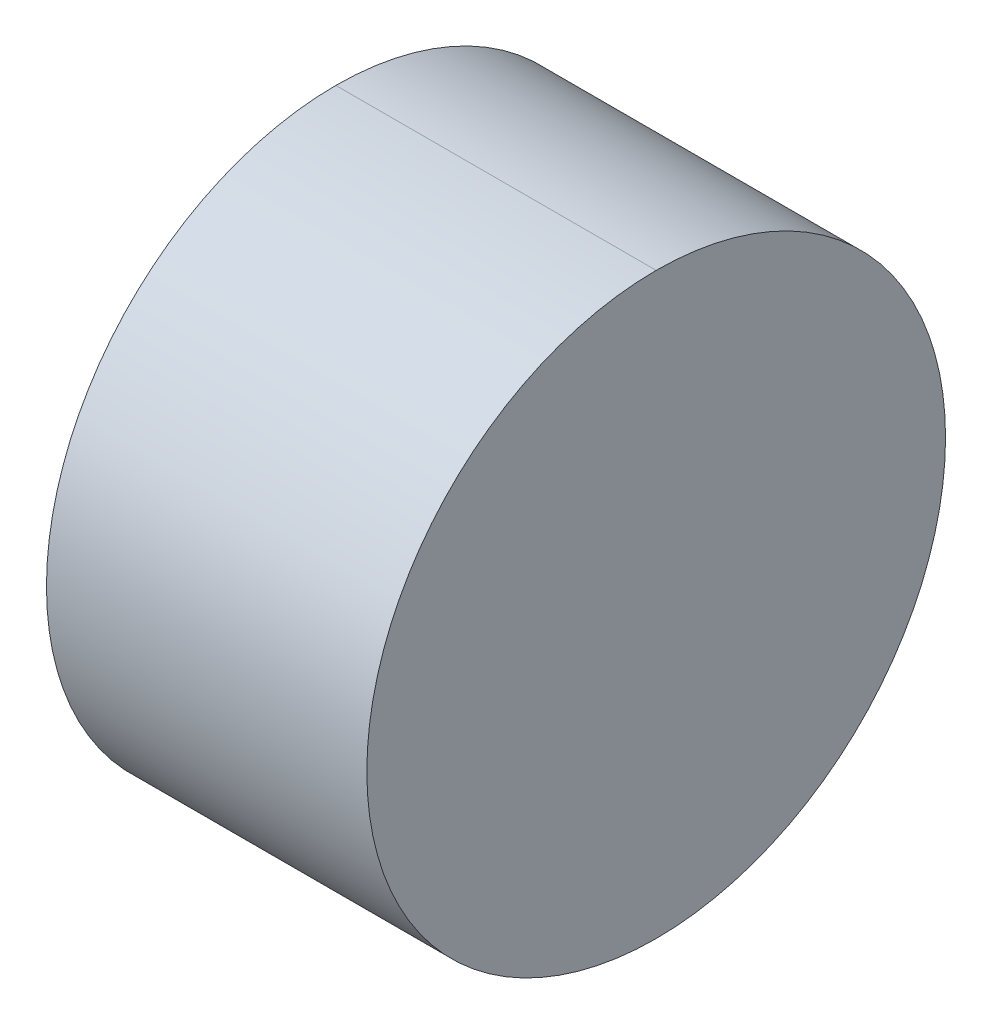
ISO-10303-21;
HEADER;
FILE_DESCRIPTION(('STEP AP214'),'2;1');
FILE_NAME('part.step','',(''),(''),'','','');
FILE_SCHEMA(('AUTOMOTIVE_DESIGN { 1 0 10303 214 1 1 1 1 }'));
ENDSEC;
DATA;
#1=APPLICATION_CONTEXT('core data for automotive mechanical design processes');
#2=APPLICATION_PROTOCOL_DEFINITION('international standard','automotive_design',2000,#1);
#3=PRODUCT_CONTEXT('',#1,'mechanical');
#4=PRODUCT('Part','Part','',(#3));
#5=PRODUCT_RELATED_PRODUCT_CATEGORY('part','',(#4));
#6=PRODUCT_DEFINITION_FORMATION('','',#4);
#7=PRODUCT_DEFINITION_CONTEXT('part definition',#1,'design');
#8=PRODUCT_DEFINITION('design','',#6,#7);
#9=PRODUCT_DEFINITION_SHAPE('','',#8);
#10=(LENGTH_UNIT() NAMED_UNIT(*) SI_UNIT(.MILLI.,.METRE.));
#11=(NAMED_UNIT(*) PLANE_ANGLE_UNIT() SI_UNIT($,.RADIAN.));
#12=(NAMED_UNIT(*) SI_UNIT($,.STERADIAN.) SOLID_ANGLE_UNIT());
#13=UNCERTAINTY_MEASURE_WITH_UNIT(LENGTH_MEASURE(1.E-05),#10,'distance_accuracy_value','');
#14=(GEOMETRIC_REPRESENTATION_CONTEXT(3) GLOBAL_UNCERTAINTY_ASSIGNED_CONTEXT((#13)) GLOBAL_UNIT_ASSIGNED_CONTEXT((#10,
#11,#12)) REPRESENTATION_CONTEXT('',''));
#15=CARTESIAN_POINT('',(0.,0.,0.));
#16=DIRECTION('',(0.,0.,1.));
#17=DIRECTION('',(1.,0.,0.));
#18=AXIS2_PLACEMENT_3D('',#15,#16,#17);
#19=CARTESIAN_POINT('',(149.23796174037,52.650816622128,1.748855384189));
#20=DIRECTION('',(-1.,-4.37113882867399E-08,4.37114091299599E-08));
#21=DIRECTION('',(-4.371138828674E-08,1.,0.));
#22=AXIS2_PLACEMENT_3D('',#19,#20,#21);
#23=PLANE('',#22);
#24=CARTESIAN_POINT('',(149.23796174037,52.650816622128,1.748855384189));
#25=DIRECTION('',(-1.,-4.37113882867399E-08,4.37114091299599E-08));
#26=DIRECTION('',(-4.37114021394238E-08,0.999999999999999,0.));
#27=AXIS2_PLACEMENT_3D('',#24,#25,#26);
#28=CIRCLE('',#27,0.711200000000003);
#29=CARTESIAN_POINT('',(149.237961709282,53.362016622128,1.748855384189));
#30=VERTEX_POINT('',#29);
#31=CARTESIAN_POINT('',(149.237961771458,51.939616622128,1.748855384189));
#32=VERTEX_POINT('',#31);
#33=EDGE_CURVE('E46',#30,#32,#28,.T.);
#34=ORIENTED_EDGE('',*,*,#33,.F.);
#35=CARTESIAN_POINT('',(149.23796174037,52.650816622128,1.748855384189));
#36=DIRECTION('',(-1.,-4.37113882867399E-08,4.37114091299599E-08));
#37=DIRECTION('',(4.37114021394238E-08,-0.999999999999999,0.));
#38=AXIS2_PLACEMENT_3D('',#35,#36,#37);
#39=CIRCLE('',#38,0.711200000000003);
#40=EDGE_CURVE('E44',#32,#30,#39,.T.);
#41=ORIENTED_EDGE('',*,*,#40,.F.);
#42=EDGE_LOOP('',(#34,#41));
#43=FACE_BOUND('',#42,.T.);
#44=ADVANCED_FACE('F16',(#43),#23,.F.);
#45=CARTESIAN_POINT('',(148.45056174037,52.65081658771,1.748855418607));
#46=DIRECTION('',(-1.,-4.37113882867399E-08,4.37114091299599E-08));
#47=DIRECTION('',(-4.371138828674E-08,1.,0.));
#48=AXIS2_PLACEMENT_3D('',#45,#46,#47);
#49=PLANE('',#48);
#50=CARTESIAN_POINT('',(148.45056174037,52.6508165877096,1.74885541860736));
#51=DIRECTION('',(1.,4.37113882867399E-08,-4.37114091299599E-08));
#52=DIRECTION('',(-4.37114021394238E-08,0.999999999999999,-5.11916605062754E-13));
#53=AXIS2_PLACEMENT_3D('',#50,#51,#52);
#54=CIRCLE('',#53,0.711200000000003);
#55=CARTESIAN_POINT('',(148.450561709282,53.3620165877098,1.74885541860712));
#56=VERTEX_POINT('',#55);
#57=CARTESIAN_POINT('',(148.450561771458,51.9396165877098,1.74885541860724));
#58=VERTEX_POINT('',#57);
#59=EDGE_CURVE('E28',#56,#58,#54,.T.);
#60=ORIENTED_EDGE('',*,*,#59,.F.);
#61=CARTESIAN_POINT('',(148.45056174037,52.6508165877096,1.74885541860736));
#62=DIRECTION('',(1.,4.37113882867399E-08,-4.37114091299599E-08));
#63=DIRECTION('',(4.37114021394242E-08,-0.999999999999999,0.));
#64=AXIS2_PLACEMENT_3D('',#61,#62,#63);
#65=CIRCLE('',#64,0.711199999999996);
#66=EDGE_CURVE('E35',#58,#56,#65,.T.);
#67=ORIENTED_EDGE('',*,*,#66,.F.);
#68=EDGE_LOOP('',(#60,#67));
#69=FACE_BOUND('',#68,.T.);
#70=ADVANCED_FACE('F158',(#69),#49,.T.);
#71=CARTESIAN_POINT('',(149.23796174037,52.650816622128,1.748855384189));
#72=DIRECTION('',(-1.,-4.37113882867399E-08,4.37114091299599E-08));
#73=DIRECTION('',(4.371138828674E-08,-1.,0.));
#74=AXIS2_PLACEMENT_3D('',#71,#72,#73);
#75=CYLINDRICAL_SURFACE('',#74,0.7112);
#76=CARTESIAN_POINT('',(148.45056177146,51.9396165877097,1.74885541860736));
#77=DIRECTION('',(0.999999999999998,4.37113832556823E-08,-4.37114091421452E-08));
#78=VECTOR('',#77,1.);
#79=LINE('',#76,#78);
#80=EDGE_CURVE('E11',#58,#32,#79,.T.);
#81=ORIENTED_EDGE('',*,*,#80,.F.);
#82=ORIENTED_EDGE('',*,*,#66,.T.);
#83=CARTESIAN_POINT('',(149.23796170928,53.362016622128,1.748855384189));
#84=DIRECTION('',(-0.999999999999998,-4.37113920680952E-08,4.37114091421452E-08));
#85=VECTOR('',#84,1.);
#86=LINE('',#83,#85);
#87=EDGE_CURVE('E55',#30,#56,#86,.T.);
#88=ORIENTED_EDGE('',*,*,#87,.F.);
#89=ORIENTED_EDGE('',*,*,#33,.T.);
#90=EDGE_LOOP('',(#81,#82,#88,#89));
#91=FACE_BOUND('',#90,.T.);
#92=ADVANCED_FACE('F57',(#91),#75,.T.);
#93=CARTESIAN_POINT('',(149.23796174037,52.650816622128,1.748855384189));
#94=DIRECTION('',(-1.,-4.37113882867399E-08,4.37114091299599E-08));
#95=DIRECTION('',(4.371138828674E-08,-1.,0.));
#96=AXIS2_PLACEMENT_3D('',#93,#94,#95);
#97=CYLINDRICAL_SURFACE('',#96,0.7112);
#98=ORIENTED_EDGE('',*,*,#59,.T.);
#99=ORIENTED_EDGE('',*,*,#80,.T.);
#100=ORIENTED_EDGE('',*,*,#40,.T.);
#101=ORIENTED_EDGE('',*,*,#87,.T.);
#102=EDGE_LOOP('',(#98,#99,#100,#101));
#103=FACE_BOUND('',#102,.T.);
#104=ADVANCED_FACE('F66',(#103),#97,.T.);
#105=CLOSED_SHELL('',(#44,#70,#92,#104));
#106=MANIFOLD_SOLID_BREP('B1',#105);
#107=ADVANCED_BREP_SHAPE_REPRESENTATION('',(#18,#106),#14);
#108=SHAPE_DEFINITION_REPRESENTATION(#9,#107);
ENDSEC;
END-ISO-10303-21;
